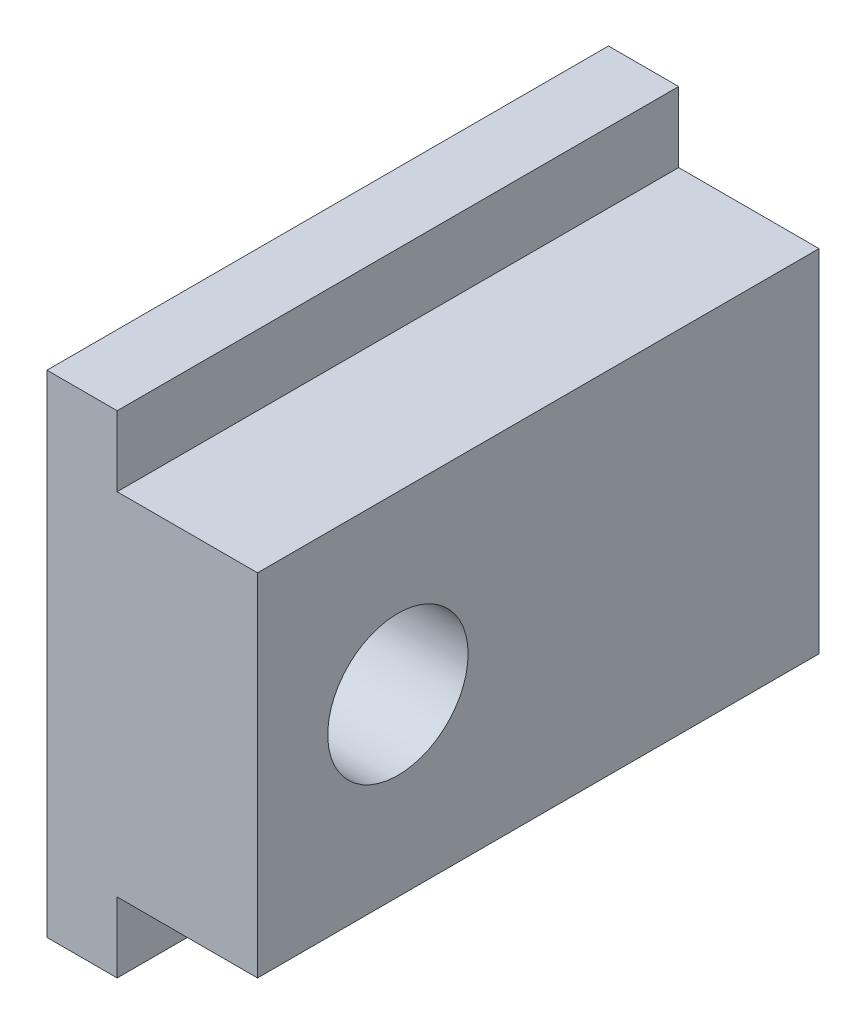
ISO-10303-21;
HEADER;
FILE_DESCRIPTION(('STEP AP214'),'2;1');
FILE_NAME('part.step','',(''),(''),'','','');
FILE_SCHEMA(('AUTOMOTIVE_DESIGN { 1 0 10303 214 1 1 1 1 }'));
ENDSEC;
DATA;
#1=APPLICATION_CONTEXT('core data for automotive mechanical design processes');
#2=APPLICATION_PROTOCOL_DEFINITION('international standard','automotive_design',2000,#1);
#3=PRODUCT_CONTEXT('',#1,'mechanical');
#4=PRODUCT('Part','Part','',(#3));
#5=PRODUCT_RELATED_PRODUCT_CATEGORY('part','',(#4));
#6=PRODUCT_DEFINITION_FORMATION('','',#4);
#7=PRODUCT_DEFINITION_CONTEXT('part definition',#1,'design');
#8=PRODUCT_DEFINITION('design','',#6,#7);
#9=PRODUCT_DEFINITION_SHAPE('','',#8);
#10=(LENGTH_UNIT() NAMED_UNIT(*) SI_UNIT(.MILLI.,.METRE.));
#11=(NAMED_UNIT(*) PLANE_ANGLE_UNIT() SI_UNIT($,.RADIAN.));
#12=(NAMED_UNIT(*) SI_UNIT($,.STERADIAN.) SOLID_ANGLE_UNIT());
#13=UNCERTAINTY_MEASURE_WITH_UNIT(LENGTH_MEASURE(1.E-05),#10,'distance_accuracy_value','');
#14=(GEOMETRIC_REPRESENTATION_CONTEXT(3) GLOBAL_UNCERTAINTY_ASSIGNED_CONTEXT((#13)) GLOBAL_UNIT_ASSIGNED_CONTEXT((#10,
#11,#12)) REPRESENTATION_CONTEXT('',''));
#15=CARTESIAN_POINT('',(0.,0.,0.));
#16=DIRECTION('',(0.,0.,1.));
#17=DIRECTION('',(1.,0.,0.));
#18=AXIS2_PLACEMENT_3D('',#15,#16,#17);
#19=CARTESIAN_POINT('',(0.,22.225,25.4));
#20=DIRECTION('',(1.,0.,0.));
#21=DIRECTION('',(0.,0.,-1.));
#22=AXIS2_PLACEMENT_3D('',#19,#20,#21);
#23=PLANE('',#22);
#24=CARTESIAN_POINT('',(0.,11.1125,19.05));
#25=DIRECTION('',(1.,0.,0.));
#26=DIRECTION('',(0.,0.,-1.));
#27=AXIS2_PLACEMENT_3D('',#24,#25,#26);
#28=CIRCLE('',#27,3.175);
#29=CARTESIAN_POINT('',(0.,11.1125,15.875));
#30=VERTEX_POINT('',#29);
#31=EDGE_CURVE('E140',#30,#30,#28,.T.);
#32=ORIENTED_EDGE('',*,*,#31,.T.);
#33=EDGE_LOOP('',(#32));
#34=FACE_BOUND('',#33,.T.);
#35=DIRECTION('',(0.,-1.,0.));
#36=VECTOR('',#35,1.);
#37=CARTESIAN_POINT('',(0.,22.225,0.));
#38=LINE('',#37,#36);
#39=CARTESIAN_POINT('',(0.,22.225,0.));
#40=VERTEX_POINT('',#39);
#41=CARTESIAN_POINT('',(0.,0.,0.));
#42=VERTEX_POINT('',#41);
#43=EDGE_CURVE('E136',#40,#42,#38,.T.);
#44=ORIENTED_EDGE('',*,*,#43,.T.);
#45=DIRECTION('',(0.,0.,-1.));
#46=VECTOR('',#45,1.);
#47=CARTESIAN_POINT('',(0.,0.,25.4));
#48=LINE('',#47,#46);
#49=CARTESIAN_POINT('',(0.,0.,25.4));
#50=VERTEX_POINT('',#49);
#51=EDGE_CURVE('E11',#50,#42,#48,.T.);
#52=ORIENTED_EDGE('',*,*,#51,.F.);
#53=DIRECTION('',(0.,-1.,0.));
#54=VECTOR('',#53,1.);
#55=CARTESIAN_POINT('',(0.,22.225,25.4));
#56=LINE('',#55,#54);
#57=CARTESIAN_POINT('',(0.,22.225,25.4));
#58=VERTEX_POINT('',#57);
#59=EDGE_CURVE('E151',#58,#50,#56,.T.);
#60=ORIENTED_EDGE('',*,*,#59,.F.);
#61=DIRECTION('',(0.,0.,-1.));
#62=VECTOR('',#61,1.);
#63=CARTESIAN_POINT('',(0.,22.225,25.4));
#64=LINE('',#63,#62);
#65=EDGE_CURVE('E132',#58,#40,#64,.T.);
#66=ORIENTED_EDGE('',*,*,#65,.T.);
#67=EDGE_LOOP('',(#44,#52,#60,#66));
#68=FACE_BOUND('',#67,.T.);
#69=ADVANCED_FACE('F38',(#34,#68),#23,.F.);
#70=CARTESIAN_POINT('',(0.,0.,25.4));
#71=DIRECTION('',(0.,1.,0.));
#72=DIRECTION('',(0.,0.,1.));
#73=AXIS2_PLACEMENT_3D('',#70,#71,#72);
#74=PLANE('',#73);
#75=DIRECTION('',(1.,0.,0.));
#76=VECTOR('',#75,1.);
#77=CARTESIAN_POINT('',(0.,0.,0.));
#78=LINE('',#77,#76);
#79=CARTESIAN_POINT('',(3.175,0.,0.));
#80=VERTEX_POINT('',#79);
#81=EDGE_CURVE('E139',#42,#80,#78,.T.);
#82=ORIENTED_EDGE('',*,*,#81,.T.);
#83=DIRECTION('',(0.,0.,-1.));
#84=VECTOR('',#83,1.);
#85=CARTESIAN_POINT('',(3.175,0.,25.4));
#86=LINE('',#85,#84);
#87=CARTESIAN_POINT('',(3.175,0.,25.4));
#88=VERTEX_POINT('',#87);
#89=EDGE_CURVE('E46',#88,#80,#86,.T.);
#90=ORIENTED_EDGE('',*,*,#89,.F.);
#91=DIRECTION('',(1.,0.,0.));
#92=VECTOR('',#91,1.);
#93=CARTESIAN_POINT('',(0.,0.,25.4));
#94=LINE('',#93,#92);
#95=EDGE_CURVE('E98',#50,#88,#94,.T.);
#96=ORIENTED_EDGE('',*,*,#95,.F.);
#97=ORIENTED_EDGE('',*,*,#51,.T.);
#98=EDGE_LOOP('',(#82,#90,#96,#97));
#99=FACE_BOUND('',#98,.T.);
#100=ADVANCED_FACE('F212',(#99),#74,.F.);
#101=CARTESIAN_POINT('',(3.175,0.,25.4));
#102=DIRECTION('',(-1.,0.,0.));
#103=DIRECTION('',(0.,0.,1.));
#104=AXIS2_PLACEMENT_3D('',#101,#102,#103);
#105=PLANE('',#104);
#106=DIRECTION('',(0.,1.,0.));
#107=VECTOR('',#106,1.);
#108=CARTESIAN_POINT('',(3.175,0.,0.));
#109=LINE('',#108,#107);
#110=CARTESIAN_POINT('',(3.175,3.175,0.));
#111=VERTEX_POINT('',#110);
#112=EDGE_CURVE('E142',#80,#111,#109,.T.);
#113=ORIENTED_EDGE('',*,*,#112,.T.);
#114=DIRECTION('',(0.,0.,-1.));
#115=VECTOR('',#114,1.);
#116=CARTESIAN_POINT('',(3.175,3.175,25.4));
#117=LINE('',#116,#115);
#118=CARTESIAN_POINT('',(3.175,3.175,25.4));
#119=VERTEX_POINT('',#118);
#120=EDGE_CURVE('E158',#119,#111,#117,.T.);
#121=ORIENTED_EDGE('',*,*,#120,.F.);
#122=DIRECTION('',(0.,1.,0.));
#123=VECTOR('',#122,1.);
#124=CARTESIAN_POINT('',(3.175,0.,25.4));
#125=LINE('',#124,#123);
#126=EDGE_CURVE('E166',#88,#119,#125,.T.);
#127=ORIENTED_EDGE('',*,*,#126,.F.);
#128=ORIENTED_EDGE('',*,*,#89,.T.);
#129=EDGE_LOOP('',(#113,#121,#127,#128));
#130=FACE_BOUND('',#129,.T.);
#131=ADVANCED_FACE('F164',(#130),#105,.F.);
#132=CARTESIAN_POINT('',(3.175,3.175,25.4));
#133=DIRECTION('',(0.,1.,0.));
#134=DIRECTION('',(0.,0.,1.));
#135=AXIS2_PLACEMENT_3D('',#132,#133,#134);
#136=PLANE('',#135);
#137=DIRECTION('',(1.,0.,0.));
#138=VECTOR('',#137,1.);
#139=CARTESIAN_POINT('',(3.175,3.175,0.));
#140=LINE('',#139,#138);
#141=CARTESIAN_POINT('',(9.525,3.175,0.));
#142=VERTEX_POINT('',#141);
#143=EDGE_CURVE('E144',#111,#142,#140,.T.);
#144=ORIENTED_EDGE('',*,*,#143,.T.);
#145=DIRECTION('',(0.,0.,-1.));
#146=VECTOR('',#145,1.);
#147=CARTESIAN_POINT('',(9.525,3.175,25.4));
#148=LINE('',#147,#146);
#149=CARTESIAN_POINT('',(9.525,3.175,25.4));
#150=VERTEX_POINT('',#149);
#151=EDGE_CURVE('E155',#150,#142,#148,.T.);
#152=ORIENTED_EDGE('',*,*,#151,.F.);
#153=DIRECTION('',(1.,0.,0.));
#154=VECTOR('',#153,1.);
#155=CARTESIAN_POINT('',(3.175,3.175,25.4));
#156=LINE('',#155,#154);
#157=EDGE_CURVE('E178',#119,#150,#156,.T.);
#158=ORIENTED_EDGE('',*,*,#157,.F.);
#159=ORIENTED_EDGE('',*,*,#120,.T.);
#160=EDGE_LOOP('',(#144,#152,#158,#159));
#161=FACE_BOUND('',#160,.T.);
#162=ADVANCED_FACE('F174',(#161),#136,.F.);
#163=CARTESIAN_POINT('',(9.525,3.175,25.4));
#164=DIRECTION('',(-1.,0.,0.));
#165=DIRECTION('',(0.,0.,1.));
#166=AXIS2_PLACEMENT_3D('',#163,#164,#165);
#167=PLANE('',#166);
#168=CARTESIAN_POINT('',(9.525,11.1125,19.05));
#169=DIRECTION('',(1.,0.,0.));
#170=DIRECTION('',(0.,0.,-1.));
#171=AXIS2_PLACEMENT_3D('',#168,#169,#170);
#172=CIRCLE('',#171,3.175);
#173=CARTESIAN_POINT('',(9.525,11.1125,15.875));
#174=VERTEX_POINT('',#173);
#175=EDGE_CURVE('E184',#174,#174,#172,.T.);
#176=ORIENTED_EDGE('',*,*,#175,.F.);
#177=EDGE_LOOP('',(#176));
#178=FACE_BOUND('',#177,.T.);
#179=DIRECTION('',(0.,1.,0.));
#180=VECTOR('',#179,1.);
#181=CARTESIAN_POINT('',(9.525,3.175,0.));
#182=LINE('',#181,#180);
#183=CARTESIAN_POINT('',(9.525,19.05,0.));
#184=VERTEX_POINT('',#183);
#185=EDGE_CURVE('E146',#142,#184,#182,.T.);
#186=ORIENTED_EDGE('',*,*,#185,.T.);
#187=DIRECTION('',(0.,0.,-1.));
#188=VECTOR('',#187,1.);
#189=CARTESIAN_POINT('',(9.525,19.05,25.4));
#190=LINE('',#189,#188);
#191=CARTESIAN_POINT('',(9.525,19.05,25.4));
#192=VERTEX_POINT('',#191);
#193=EDGE_CURVE('E127',#192,#184,#190,.T.);
#194=ORIENTED_EDGE('',*,*,#193,.F.);
#195=DIRECTION('',(0.,1.,0.));
#196=VECTOR('',#195,1.);
#197=CARTESIAN_POINT('',(9.525,3.175,25.4));
#198=LINE('',#197,#196);
#199=EDGE_CURVE('E118',#150,#192,#198,.T.);
#200=ORIENTED_EDGE('',*,*,#199,.F.);
#201=ORIENTED_EDGE('',*,*,#151,.T.);
#202=EDGE_LOOP('',(#186,#194,#200,#201));
#203=FACE_BOUND('',#202,.T.);
#204=ADVANCED_FACE('F177',(#178,#203),#167,.F.);
#205=CARTESIAN_POINT('',(9.525,19.05,25.4));
#206=DIRECTION('',(0.,-1.,0.));
#207=DIRECTION('',(0.,0.,-1.));
#208=AXIS2_PLACEMENT_3D('',#205,#206,#207);
#209=PLANE('',#208);
#210=DIRECTION('',(-1.,0.,0.));
#211=VECTOR('',#210,1.);
#212=CARTESIAN_POINT('',(9.525,19.05,0.));
#213=LINE('',#212,#211);
#214=CARTESIAN_POINT('',(3.175,19.05,0.));
#215=VERTEX_POINT('',#214);
#216=EDGE_CURVE('E126',#184,#215,#213,.T.);
#217=ORIENTED_EDGE('',*,*,#216,.T.);
#218=DIRECTION('',(0.,0.,-1.));
#219=VECTOR('',#218,1.);
#220=CARTESIAN_POINT('',(3.175,19.05,25.4));
#221=LINE('',#220,#219);
#222=CARTESIAN_POINT('',(3.175,19.05,25.4));
#223=VERTEX_POINT('',#222);
#224=EDGE_CURVE('E123',#223,#215,#221,.T.);
#225=ORIENTED_EDGE('',*,*,#224,.F.);
#226=DIRECTION('',(-1.,0.,0.));
#227=VECTOR('',#226,1.);
#228=CARTESIAN_POINT('',(9.525,19.05,25.4));
#229=LINE('',#228,#227);
#230=EDGE_CURVE('E112',#192,#223,#229,.T.);
#231=ORIENTED_EDGE('',*,*,#230,.F.);
#232=ORIENTED_EDGE('',*,*,#193,.T.);
#233=EDGE_LOOP('',(#217,#225,#231,#232));
#234=FACE_BOUND('',#233,.T.);
#235=ADVANCED_FACE('F124',(#234),#209,.F.);
#236=CARTESIAN_POINT('',(3.175,19.05,25.4));
#237=DIRECTION('',(-1.,0.,0.));
#238=DIRECTION('',(0.,0.,1.));
#239=AXIS2_PLACEMENT_3D('',#236,#237,#238);
#240=PLANE('',#239);
#241=DIRECTION('',(0.,1.,0.));
#242=VECTOR('',#241,1.);
#243=CARTESIAN_POINT('',(3.175,19.05,0.));
#244=LINE('',#243,#242);
#245=CARTESIAN_POINT('',(3.175,22.225,0.));
#246=VERTEX_POINT('',#245);
#247=EDGE_CURVE('E84',#215,#246,#244,.T.);
#248=ORIENTED_EDGE('',*,*,#247,.T.);
#249=DIRECTION('',(0.,0.,-1.));
#250=VECTOR('',#249,1.);
#251=CARTESIAN_POINT('',(3.175,22.225,25.4));
#252=LINE('',#251,#250);
#253=CARTESIAN_POINT('',(3.175,22.225,25.4));
#254=VERTEX_POINT('',#253);
#255=EDGE_CURVE('E128',#254,#246,#252,.T.);
#256=ORIENTED_EDGE('',*,*,#255,.F.);
#257=DIRECTION('',(0.,1.,0.));
#258=VECTOR('',#257,1.);
#259=CARTESIAN_POINT('',(3.175,19.05,25.4));
#260=LINE('',#259,#258);
#261=EDGE_CURVE('E116',#223,#254,#260,.T.);
#262=ORIENTED_EDGE('',*,*,#261,.F.);
#263=ORIENTED_EDGE('',*,*,#224,.T.);
#264=EDGE_LOOP('',(#248,#256,#262,#263));
#265=FACE_BOUND('',#264,.T.);
#266=ADVANCED_FACE('F130',(#265),#240,.F.);
#267=CARTESIAN_POINT('',(3.175,22.225,25.4));
#268=DIRECTION('',(0.,-1.,0.));
#269=DIRECTION('',(0.,0.,-1.));
#270=AXIS2_PLACEMENT_3D('',#267,#268,#269);
#271=PLANE('',#270);
#272=DIRECTION('',(-1.,0.,0.));
#273=VECTOR('',#272,1.);
#274=CARTESIAN_POINT('',(3.175,22.225,0.));
#275=LINE('',#274,#273);
#276=EDGE_CURVE('E90',#246,#40,#275,.T.);
#277=ORIENTED_EDGE('',*,*,#276,.T.);
#278=ORIENTED_EDGE('',*,*,#65,.F.);
#279=DIRECTION('',(-1.,0.,0.));
#280=VECTOR('',#279,1.);
#281=CARTESIAN_POINT('',(3.175,22.225,25.4));
#282=LINE('',#281,#280);
#283=EDGE_CURVE('E54',#254,#58,#282,.T.);
#284=ORIENTED_EDGE('',*,*,#283,.F.);
#285=ORIENTED_EDGE('',*,*,#255,.T.);
#286=EDGE_LOOP('',(#277,#278,#284,#285));
#287=FACE_BOUND('',#286,.T.);
#288=ADVANCED_FACE('F208',(#287),#271,.F.);
#289=CARTESIAN_POINT('',(0.,0.,25.4));
#290=DIRECTION('',(0.,0.,1.));
#291=DIRECTION('',(1.,0.,0.));
#292=AXIS2_PLACEMENT_3D('',#289,#290,#291);
#293=PLANE('',#292);
#294=ORIENTED_EDGE('',*,*,#59,.T.);
#295=ORIENTED_EDGE('',*,*,#95,.T.);
#296=ORIENTED_EDGE('',*,*,#126,.T.);
#297=ORIENTED_EDGE('',*,*,#157,.T.);
#298=ORIENTED_EDGE('',*,*,#199,.T.);
#299=ORIENTED_EDGE('',*,*,#230,.T.);
#300=ORIENTED_EDGE('',*,*,#261,.T.);
#301=ORIENTED_EDGE('',*,*,#283,.T.);
#302=EDGE_LOOP('',(#294,#295,#296,#297,#298,#299,#300,#301));
#303=FACE_BOUND('',#302,.T.);
#304=ADVANCED_FACE('F114',(#303),#293,.T.);
#305=CARTESIAN_POINT('',(0.,0.,0.));
#306=DIRECTION('',(0.,0.,1.));
#307=DIRECTION('',(1.,0.,0.));
#308=AXIS2_PLACEMENT_3D('',#305,#306,#307);
#309=PLANE('',#308);
#310=CARTESIAN_POINT('',(4.7625,11.1125,0.));
#311=DIRECTION('',(0.,0.,-1.));
#312=DIRECTION('',(-1.,0.,0.));
#313=AXIS2_PLACEMENT_3D('',#310,#311,#312);
#314=CIRCLE('',#313,3.175);
#315=CARTESIAN_POINT('',(1.5875,11.1125,0.));
#316=VERTEX_POINT('',#315);
#317=EDGE_CURVE('E192',#316,#316,#314,.T.);
#318=ORIENTED_EDGE('',*,*,#317,.F.);
#319=EDGE_LOOP('',(#318));
#320=FACE_BOUND('',#319,.T.);
#321=ORIENTED_EDGE('',*,*,#43,.F.);
#322=ORIENTED_EDGE('',*,*,#276,.F.);
#323=ORIENTED_EDGE('',*,*,#247,.F.);
#324=ORIENTED_EDGE('',*,*,#216,.F.);
#325=ORIENTED_EDGE('',*,*,#185,.F.);
#326=ORIENTED_EDGE('',*,*,#143,.F.);
#327=ORIENTED_EDGE('',*,*,#112,.F.);
#328=ORIENTED_EDGE('',*,*,#81,.F.);
#329=EDGE_LOOP('',(#321,#322,#323,#324,#325,#326,#327,#328));
#330=FACE_BOUND('',#329,.T.);
#331=ADVANCED_FACE('F170',(#320,#330),#309,.F.);
#332=CARTESIAN_POINT('',(0.,11.1125,19.05));
#333=DIRECTION('',(1.,0.,0.));
#334=DIRECTION('',(0.,0.,-1.));
#335=AXIS2_PLACEMENT_3D('',#332,#333,#334);
#336=CYLINDRICAL_SURFACE('',#335,3.175);
#337=ORIENTED_EDGE('',*,*,#31,.F.);
#338=EDGE_LOOP('',(#337));
#339=FACE_BOUND('',#338,.T.);
#340=ORIENTED_EDGE('',*,*,#175,.T.);
#341=EDGE_LOOP('',(#340));
#342=FACE_BOUND('',#341,.T.);
#343=ADVANCED_FACE('F199',(#339,#342),#336,.F.);
#344=CARTESIAN_POINT('',(4.7625,11.1125,12.7));
#345=DIRECTION('',(0.,0.,-1.));
#346=DIRECTION('',(-1.,0.,0.));
#347=AXIS2_PLACEMENT_3D('',#344,#345,#346);
#348=CONICAL_SURFACE('',#347,3.17499999999999,1.02974425867665);
#349=CARTESIAN_POINT('',(4.76249999999999,11.1125,14.6077324654125));
#350=VERTEX_POINT('',#349);
#351=VERTEX_LOOP('',#350);
#352=FACE_BOUND('',#351,.T.);
#353=CARTESIAN_POINT('',(4.7625,11.1125,12.7));
#354=DIRECTION('',(0.,0.,-1.));
#355=DIRECTION('',(-1.,0.,0.));
#356=AXIS2_PLACEMENT_3D('',#353,#354,#355);
#357=CIRCLE('',#356,3.17499999999999);
#358=CARTESIAN_POINT('',(1.5875,11.1125,12.7));
#359=VERTEX_POINT('',#358);
#360=EDGE_CURVE('E187',#359,#359,#357,.T.);
#361=ORIENTED_EDGE('',*,*,#360,.T.);
#362=EDGE_LOOP('',(#361));
#363=FACE_BOUND('',#362,.T.);
#364=ADVANCED_FACE('F205',(#352,#363),#348,.F.);
#365=CARTESIAN_POINT('',(4.7625,11.1125,0.));
#366=DIRECTION('',(0.,0.,-1.));
#367=DIRECTION('',(-1.,0.,0.));
#368=AXIS2_PLACEMENT_3D('',#365,#366,#367);
#369=CYLINDRICAL_SURFACE('',#368,3.175);
#370=ORIENTED_EDGE('',*,*,#360,.F.);
#371=EDGE_LOOP('',(#370));
#372=FACE_BOUND('',#371,.T.);
#373=ORIENTED_EDGE('',*,*,#317,.T.);
#374=EDGE_LOOP('',(#373));
#375=FACE_BOUND('',#374,.T.);
#376=ADVANCED_FACE('F196',(#372,#375),#369,.F.);
#377=CLOSED_SHELL('',(#69,#100,#131,#162,#204,#235,#266,#288,#304,#331,#343,#364,#376));
#378=MANIFOLD_SOLID_BREP('B2',#377);
#379=ADVANCED_BREP_SHAPE_REPRESENTATION('',(#18,#378),#14);
#380=SHAPE_DEFINITION_REPRESENTATION(#9,#379);
ENDSEC;
END-ISO-10303-21;
